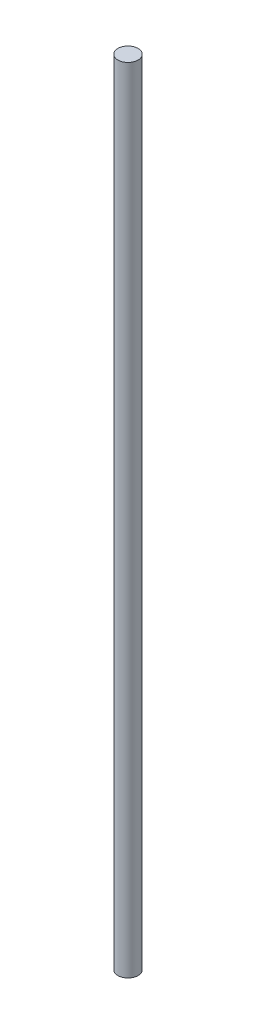
ISO-10303-21;
HEADER;
FILE_DESCRIPTION(('STEP AP214'),'2;1');
FILE_NAME('part.step','',(''),(''),'','','');
FILE_SCHEMA(('AUTOMOTIVE_DESIGN { 1 0 10303 214 1 1 1 1 }'));
ENDSEC;
DATA;
#1=APPLICATION_CONTEXT('core data for automotive mechanical design processes');
#2=APPLICATION_PROTOCOL_DEFINITION('international standard','automotive_design',2000,#1);
#3=PRODUCT_CONTEXT('',#1,'mechanical');
#4=PRODUCT('Part','Part','',(#3));
#5=PRODUCT_RELATED_PRODUCT_CATEGORY('part','',(#4));
#6=PRODUCT_DEFINITION_FORMATION('','',#4);
#7=PRODUCT_DEFINITION_CONTEXT('part definition',#1,'design');
#8=PRODUCT_DEFINITION('design','',#6,#7);
#9=PRODUCT_DEFINITION_SHAPE('','',#8);
#10=(LENGTH_UNIT() NAMED_UNIT(*) SI_UNIT(.MILLI.,.METRE.));
#11=(NAMED_UNIT(*) PLANE_ANGLE_UNIT() SI_UNIT($,.RADIAN.));
#12=(NAMED_UNIT(*) SI_UNIT($,.STERADIAN.) SOLID_ANGLE_UNIT());
#13=UNCERTAINTY_MEASURE_WITH_UNIT(LENGTH_MEASURE(1.E-05),#10,'distance_accuracy_value','');
#14=(GEOMETRIC_REPRESENTATION_CONTEXT(3) GLOBAL_UNCERTAINTY_ASSIGNED_CONTEXT((#13)) GLOBAL_UNIT_ASSIGNED_CONTEXT((#10,
#11,#12)) REPRESENTATION_CONTEXT('',''));
#15=CARTESIAN_POINT('',(0.,0.,0.));
#16=DIRECTION('',(0.,0.,1.));
#17=DIRECTION('',(1.,0.,0.));
#18=AXIS2_PLACEMENT_3D('',#15,#16,#17);
#19=CARTESIAN_POINT('',(0.,120.,0.));
#20=DIRECTION('',(0.,-1.,0.));
#21=DIRECTION('',(0.,0.,-1.));
#22=AXIS2_PLACEMENT_3D('',#19,#20,#21);
#23=CYLINDRICAL_SURFACE('',#22,1.525);
#24=CARTESIAN_POINT('',(0.,120.,0.));
#25=DIRECTION('',(0.,1.,0.));
#26=DIRECTION('',(0.,0.,1.));
#27=AXIS2_PLACEMENT_3D('',#24,#25,#26);
#28=CIRCLE('',#27,1.525);
#29=CARTESIAN_POINT('',(0.,120.,1.525));
#30=VERTEX_POINT('',#29);
#31=EDGE_CURVE('E10',#30,#30,#28,.T.);
#32=ORIENTED_EDGE('',*,*,#31,.F.);
#33=EDGE_LOOP('',(#32));
#34=FACE_BOUND('',#33,.T.);
#35=CARTESIAN_POINT('',(0.,0.,0.));
#36=DIRECTION('',(0.,1.,0.));
#37=DIRECTION('',(0.,0.,1.));
#38=AXIS2_PLACEMENT_3D('',#35,#36,#37);
#39=CIRCLE('',#38,1.525);
#40=CARTESIAN_POINT('',(0.,0.,1.525));
#41=VERTEX_POINT('',#40);
#42=EDGE_CURVE('E40',#41,#41,#39,.T.);
#43=ORIENTED_EDGE('',*,*,#42,.T.);
#44=EDGE_LOOP('',(#43));
#45=FACE_BOUND('',#44,.T.);
#46=ADVANCED_FACE('F37',(#34,#45),#23,.T.);
#47=CARTESIAN_POINT('',(0.,120.,0.));
#48=DIRECTION('',(0.,1.,0.));
#49=DIRECTION('',(0.,0.,1.));
#50=AXIS2_PLACEMENT_3D('',#47,#48,#49);
#51=PLANE('',#50);
#52=ORIENTED_EDGE('',*,*,#31,.T.);
#53=EDGE_LOOP('',(#52));
#54=FACE_BOUND('',#53,.T.);
#55=ADVANCED_FACE('F54',(#54),#51,.T.);
#56=CARTESIAN_POINT('',(0.,0.,0.));
#57=DIRECTION('',(0.,1.,0.));
#58=DIRECTION('',(0.,0.,1.));
#59=AXIS2_PLACEMENT_3D('',#56,#57,#58);
#60=PLANE('',#59);
#61=ORIENTED_EDGE('',*,*,#42,.F.);
#62=EDGE_LOOP('',(#61));
#63=FACE_BOUND('',#62,.T.);
#64=ADVANCED_FACE('F52',(#63),#60,.F.);
#65=CLOSED_SHELL('',(#46,#55,#64));
#66=MANIFOLD_SOLID_BREP('B2',#65);
#67=ADVANCED_BREP_SHAPE_REPRESENTATION('',(#18,#66),#14);
#68=SHAPE_DEFINITION_REPRESENTATION(#9,#67);
ENDSEC;
END-ISO-10303-21;
